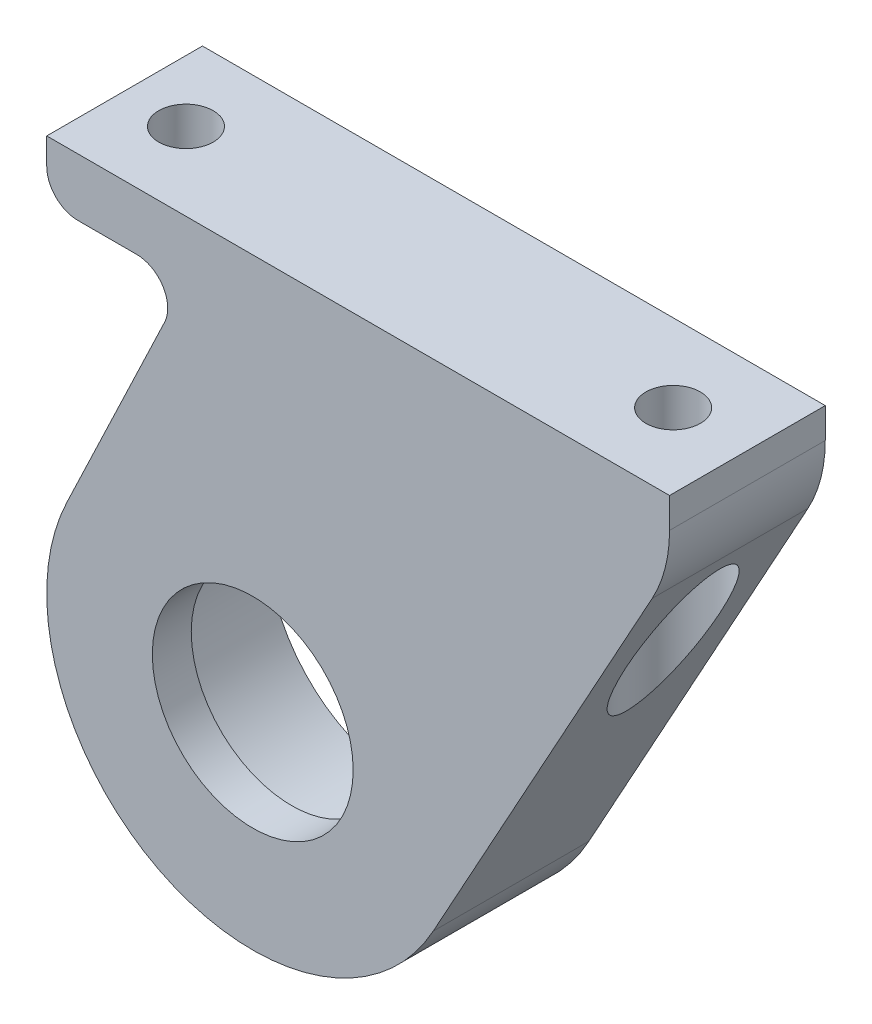
ISO-10303-21;
HEADER;
FILE_DESCRIPTION(('STEP AP214'),'2;1');
FILE_NAME('part.step','',(''),(''),'','','');
FILE_SCHEMA(('AUTOMOTIVE_DESIGN { 1 0 10303 214 1 1 1 1 }'));
ENDSEC;
DATA;
#1=APPLICATION_CONTEXT('core data for automotive mechanical design processes');
#2=APPLICATION_PROTOCOL_DEFINITION('international standard','automotive_design',2000,#1);
#3=PRODUCT_CONTEXT('',#1,'mechanical');
#4=PRODUCT('Part','Part','',(#3));
#5=PRODUCT_RELATED_PRODUCT_CATEGORY('part','',(#4));
#6=PRODUCT_DEFINITION_FORMATION('','',#4);
#7=PRODUCT_DEFINITION_CONTEXT('part definition',#1,'design');
#8=PRODUCT_DEFINITION('design','',#6,#7);
#9=PRODUCT_DEFINITION_SHAPE('','',#8);
#10=(LENGTH_UNIT() NAMED_UNIT(*) SI_UNIT(.MILLI.,.METRE.));
#11=(NAMED_UNIT(*) PLANE_ANGLE_UNIT() SI_UNIT($,.RADIAN.));
#12=(NAMED_UNIT(*) SI_UNIT($,.STERADIAN.) SOLID_ANGLE_UNIT());
#13=UNCERTAINTY_MEASURE_WITH_UNIT(LENGTH_MEASURE(1.E-05),#10,'distance_accuracy_value','');
#14=(GEOMETRIC_REPRESENTATION_CONTEXT(3) GLOBAL_UNCERTAINTY_ASSIGNED_CONTEXT((#13)) GLOBAL_UNIT_ASSIGNED_CONTEXT((#10,
#11,#12)) REPRESENTATION_CONTEXT('',''));
#15=CARTESIAN_POINT('',(0.,0.,0.));
#16=DIRECTION('',(0.,0.,1.));
#17=DIRECTION('',(1.,0.,0.));
#18=AXIS2_PLACEMENT_3D('',#15,#16,#17);
#19=CARTESIAN_POINT('',(-20.423245911174,18.3245528808047,30.));
#20=DIRECTION('',(0.,0.,-1.));
#21=DIRECTION('',(-1.,0.,0.));
#22=AXIS2_PLACEMENT_3D('',#19,#20,#21);
#23=CYLINDRICAL_SURFACE('',#22,2.);
#24=CARTESIAN_POINT('',(-20.4232459111739,16.3245528808047,27.2872392211941));
#25=CARTESIAN_POINT('',(-20.4887695492939,16.3245611442696,27.2316402768121));
#26=CARTESIAN_POINT('',(-20.551782925905,16.3277700807168,27.1733011664086));
#27=CARTESIAN_POINT('',(-20.6722658688388,16.3391942056474,27.0518072117411));
#28=CARTESIAN_POINT('',(-20.7297457982924,16.3473998163829,26.9886617824721));
#29=CARTESIAN_POINT('',(-20.8929254544888,16.3773502421294,26.7933198872976));
#30=CARTESIAN_POINT('',(-20.990019498793,16.404456252849,26.6546578776922));
#31=CARTESIAN_POINT('',(-21.1493133231444,16.4593263762254,26.3810891084359));
#32=CARTESIAN_POINT('',(-21.2142721504513,16.4866392343981,26.247654258765));
#33=CARTESIAN_POINT('',(-21.3240672508794,16.5378766477722,25.9718411288955));
#34=CARTESIAN_POINT('',(-21.3688910002988,16.5617990878733,25.8294573451789));
#35=CARTESIAN_POINT('',(-21.422374733152,16.5918592511803,25.601091292535));
#36=CARTESIAN_POINT('',(-21.4382973581837,16.601221299669,25.5171794330497));
#37=CARTESIAN_POINT('',(-21.4629547439993,16.6159811711615,25.3479328798189));
#38=CARTESIAN_POINT('',(-21.4716895825385,16.6213790370486,25.2625982014752));
#39=CARTESIAN_POINT('',(-21.4818035637808,16.6276465166273,25.0914473592264));
#40=CARTESIAN_POINT('',(-21.4831929708175,16.6285224491222,25.005632035034));
#41=CARTESIAN_POINT('',(-21.4786189332838,16.6256722751133,24.8342808120176));
#42=CARTESIAN_POINT('',(-21.4726561490108,16.6219465818797,24.7487448887923));
#43=CARTESIAN_POINT('',(-21.4548800024892,16.6111295588673,24.5911273517689));
#44=CARTESIAN_POINT('',(-21.4440407518192,16.6046048197193,24.5188938704581));
#45=CARTESIAN_POINT('',(-21.4171956758794,16.5889540710241,24.3756702318387));
#46=CARTESIAN_POINT('',(-21.4011880497648,16.5798271549163,24.3046805170052));
#47=CARTESIAN_POINT('',(-21.3455594083571,16.5494077073409,24.0939109952506));
#48=CARTESIAN_POINT('',(-21.2983529040815,16.525091153502,23.95650702534));
#49=CARTESIAN_POINT('',(-21.1796357220324,16.4718577610889,23.6780021937438));
#50=CARTESIAN_POINT('',(-21.1062763295459,16.4427234273619,23.5377413121952));
#51=CARTESIAN_POINT('',(-20.9379945901458,16.3899277771758,23.2700307414862));
#52=CARTESIAN_POINT('',(-20.8431428578687,16.3662490386409,23.1425410269608));
#53=CARTESIAN_POINT('',(-20.6899188983205,16.3418053319268,22.9676647911428));
#54=CARTESIAN_POINT('',(-20.6393779675668,16.3355665416617,22.9140865005566));
#55=CARTESIAN_POINT('',(-20.534258657173,16.3269396309748,22.8105747729889));
#56=CARTESIAN_POINT('',(-20.479674782226,16.3245568560844,22.7606464872836));
#57=CARTESIAN_POINT('',(-20.4232459111739,16.3245528808047,22.7127607788059));
#58=B_SPLINE_CURVE_WITH_KNOTS('',3,(#24,#25,#26,#27,#28,#29,#30,#31,#32,#33,#34,#35,#36,#37,#38,
#39,#40,#41,#42,#43,#44,#45,#46,#47,#48,#49,#50,#51,#52,#53,#54,#55,#56,#57),.UNSPECIFIED.,.F.,
.F.,(4,2,2,2,2,2,2,2,2,2,2,2,2,2,2,2,4),(0.,0.257437488815612,0.514383061708193,
1.02573296584412,1.47702144076985,1.92859022268281,2.18600973356862,2.44342645973293,
2.70048338254542,2.95751722085984,3.17726724204111,3.39709391467932,3.83727529526278,
4.31830047479043,4.79776755690636,5.01925937750808,5.24105798640269),.UNSPECIFIED.);
#59=CARTESIAN_POINT('',(-20.4232459111739,16.3245528808047,27.2872392211941));
#60=VERTEX_POINT('',#59);
#61=CARTESIAN_POINT('',(-20.4232459111739,16.3245528808047,22.7127607788059));
#62=VERTEX_POINT('',#61);
#63=EDGE_CURVE('E174',#60,#62,#58,.T.);
#64=ORIENTED_EDGE('',*,*,#63,.F.);
#65=DIRECTION('',(0.,0.,-1.));
#66=VECTOR('',#65,1.);
#67=CARTESIAN_POINT('',(-20.4232459111739,16.3245528808047,30.));
#68=LINE('',#67,#66);
#69=CARTESIAN_POINT('',(-20.4232459111739,16.3245528808047,30.));
#70=VERTEX_POINT('',#69);
#71=EDGE_CURVE('E144',#70,#60,#68,.T.);
#72=ORIENTED_EDGE('',*,*,#71,.F.);
#73=CARTESIAN_POINT('',(-20.423245911174,18.3245528808047,30.));
#74=DIRECTION('',(0.,0.,1.));
#75=DIRECTION('',(1.,0.,0.));
#76=AXIS2_PLACEMENT_3D('',#73,#74,#75);
#77=CIRCLE('',#76,2.);
#78=CARTESIAN_POINT('',(-22.423245911174,18.3245528808047,30.));
#79=VERTEX_POINT('',#78);
#80=EDGE_CURVE('E296',#79,#70,#77,.T.);
#81=ORIENTED_EDGE('',*,*,#80,.F.);
#82=DIRECTION('',(0.,0.,-1.));
#83=VECTOR('',#82,1.);
#84=CARTESIAN_POINT('',(-22.423245911174,18.3245528808047,30.));
#85=LINE('',#84,#83);
#86=CARTESIAN_POINT('',(-22.423245911174,18.3245528808047,20.));
#87=VERTEX_POINT('',#86);
#88=EDGE_CURVE('E303',#79,#87,#85,.T.);
#89=ORIENTED_EDGE('',*,*,#88,.T.);
#90=CARTESIAN_POINT('',(-20.423245911174,18.3245528808047,20.));
#91=DIRECTION('',(0.,0.,1.));
#92=DIRECTION('',(1.,0.,0.));
#93=AXIS2_PLACEMENT_3D('',#90,#91,#92);
#94=CIRCLE('',#93,2.);
#95=CARTESIAN_POINT('',(-20.4232459111739,16.3245528808047,20.));
#96=VERTEX_POINT('',#95);
#97=EDGE_CURVE('E292',#87,#96,#94,.T.);
#98=ORIENTED_EDGE('',*,*,#97,.T.);
#99=EDGE_CURVE('E179',#62,#96,#68,.T.);
#100=ORIENTED_EDGE('',*,*,#99,.F.);
#101=EDGE_LOOP('',(#64,#72,#81,#89,#98,#100));
#102=FACE_BOUND('',#101,.T.);
#103=ADVANCED_FACE('F41',(#102),#23,.T.);
#104=CARTESIAN_POINT('',(-20.4232459111739,16.3245528808047,30.));
#105=DIRECTION('',(0.,1.,0.));
#106=DIRECTION('',(0.,0.,1.));
#107=AXIS2_PLACEMENT_3D('',#104,#105,#106);
#108=PLANE('',#107);
#109=CARTESIAN_POINT('',(-18.481973971174,16.3245528808047,25.));
#110=DIRECTION('',(0.,1.,0.));
#111=DIRECTION('',(0.,0.,1.));
#112=AXIS2_PLACEMENT_3D('',#109,#110,#111);
#113=CIRCLE('',#112,3.);
#114=CARTESIAN_POINT('',(-16.6518746680662,16.3245528808047,22.6228722077338));
#115=VERTEX_POINT('',#114);
#116=EDGE_CURVE('E183',#62,#115,#113,.F.);
#117=ORIENTED_EDGE('',*,*,#116,.F.);
#118=ORIENTED_EDGE('',*,*,#99,.T.);
#119=DIRECTION('',(1.,0.,0.));
#120=VECTOR('',#119,1.);
#121=CARTESIAN_POINT('',(-20.4232459111739,16.3245528808047,20.));
#122=LINE('',#121,#120);
#123=CARTESIAN_POINT('',(-16.6518746680662,16.3245528808047,20.));
#124=VERTEX_POINT('',#123);
#125=EDGE_CURVE('E235',#96,#124,#122,.T.);
#126=ORIENTED_EDGE('',*,*,#125,.T.);
#127=DIRECTION('',(0.,0.,-1.));
#128=VECTOR('',#127,1.);
#129=CARTESIAN_POINT('',(-16.6518746680662,16.3245528808047,30.));
#130=LINE('',#129,#128);
#131=EDGE_CURVE('E232',#115,#124,#130,.T.);
#132=ORIENTED_EDGE('',*,*,#131,.F.);
#133=EDGE_LOOP('',(#117,#118,#126,#132));
#134=FACE_BOUND('',#133,.T.);
#135=ADVANCED_FACE('F159',(#134),#108,.F.);
#136=CARTESIAN_POINT('',(-16.6518746680662,14.3245528808047,30.));
#137=DIRECTION('',(0.,0.,-1.));
#138=DIRECTION('',(-1.,0.,0.));
#139=AXIS2_PLACEMENT_3D('',#136,#137,#138);
#140=CYLINDRICAL_SURFACE('',#139,2.);
#141=CARTESIAN_POINT('',(-16.6518746680662,16.3245528808047,22.6228722077338));
#142=CARTESIAN_POINT('',(-16.5835636770514,16.324549643518,22.6754362551879));
#143=CARTESIAN_POINT('',(-16.5176343482555,16.3210561128765,22.7309071471586));
#144=CARTESIAN_POINT('',(-16.3911842158571,16.3085056162088,22.8468845897449));
#145=CARTESIAN_POINT('',(-16.3306517364897,16.2994610114274,22.9073796942529));
#146=CARTESIAN_POINT('',(-16.2157149457288,16.2772867450315,23.0324508585251));
#147=CARTESIAN_POINT('',(-16.1612726893345,16.2641845460208,23.0969972243211));
#148=CARTESIAN_POINT('',(-16.0582682598351,16.2351799310674,23.2300472511259));
#149=CARTESIAN_POINT('',(-16.0097088683158,16.2192761991344,23.2985527616945));
#150=CARTESIAN_POINT('',(-15.8862101458836,16.1740522757982,23.4891840476809));
#151=CARTESIAN_POINT('',(-15.8170870644824,16.1432379557405,23.6147776094574));
#152=CARTESIAN_POINT('',(-15.6972166485052,16.0832808890627,23.8749678468779));
#153=CARTESIAN_POINT('',(-15.6464918832367,16.054140232149,24.0095753419029));
#154=CARTESIAN_POINT('',(-15.565086491734,16.0041912388377,24.284479186991));
#155=CARTESIAN_POINT('',(-15.5341553189924,15.9832800955908,24.4246795461986));
#156=CARTESIAN_POINT('',(-15.5030296953724,15.9617141302766,24.6379720147396));
#157=CARTESIAN_POINT('',(-15.495199805572,15.9561593368413,24.7095239314719));
#158=CARTESIAN_POINT('',(-15.4847028585106,15.9486700999029,24.8532094356609));
#159=CARTESIAN_POINT('',(-15.482035611577,15.9467355233952,24.9253430016504));
#160=CARTESIAN_POINT('',(-15.4819143369453,15.9466480971483,25.0697487242641));
#161=CARTESIAN_POINT('',(-15.4844698336752,15.9485021565335,25.1420208935324));
#162=CARTESIAN_POINT('',(-15.4947639116706,15.9558497205583,25.2859931025052));
#163=CARTESIAN_POINT('',(-15.5025026983006,15.9613433694003,25.3576931194269));
#164=CARTESIAN_POINT('',(-15.5333864985258,15.9827590887057,25.5714349850466));
#165=CARTESIAN_POINT('',(-15.5641987401963,16.0036145781758,25.7119453013466));
#166=CARTESIAN_POINT('',(-15.6449776615086,16.053241774724,25.9858782513185));
#167=CARTESIAN_POINT('',(-15.6949740175126,16.0820257269677,26.1192895374218));
#168=CARTESIAN_POINT('',(-15.8130488492405,16.1413444976932,26.3772844481672));
#169=CARTESIAN_POINT('',(-15.8811055211114,16.1718771703556,26.5018784894611));
#170=CARTESIAN_POINT('',(-16.003617730507,16.2172088973466,26.692609647995));
#171=CARTESIAN_POINT('',(-16.0524884622794,16.233387010334,26.7620564339689));
#172=CARTESIAN_POINT('',(-16.1562584780787,16.2629215995418,26.8969138355029));
#173=CARTESIAN_POINT('',(-16.2111549375369,16.2762793892806,26.9623263198785));
#174=CARTESIAN_POINT('',(-16.3271519187017,16.2989055796637,27.0890562979459));
#175=CARTESIAN_POINT('',(-16.3882922118222,16.308145459133,27.1503428093555));
#176=CARTESIAN_POINT('',(-16.5160917523951,16.3209737854072,27.2677948656898));
#177=CARTESIAN_POINT('',(-16.582763201648,16.3245493679871,27.3239484817292));
#178=CARTESIAN_POINT('',(-16.6518746680662,16.3245528808047,27.3771277922662));
#179=B_SPLINE_CURVE_WITH_KNOTS('',3,(#141,#142,#143,#144,#145,#146,#147,#148,#149,#150,#151,
#152,#153,#154,#155,#156,#157,#158,#159,#160,#161,#162,#163,#164,#165,#166,#167,#168,#169,#170,
#171,#172,#173,#174,#175,#176,#177,#178),.UNSPECIFIED.,.F.,.F.,(4,2,2,2,2,2,2,2,2,2,2,2,2,2,2,2,
2,2,4),(0.,0.258265733289105,0.515958431416804,0.771943784965977,1.02804970714106,
1.46639445313713,1.90527511463488,2.33848441808795,2.55482724017938,2.77116211380854,
2.98789185737173,3.20463018838471,3.63861991957701,4.07328372410993,4.50742513653102,
4.76647032614446,5.02539460235371,5.28608536273293,5.54736733528842),.UNSPECIFIED.);
#180=CARTESIAN_POINT('',(-16.6518746680662,16.3245528808047,27.3771277922662));
#181=VERTEX_POINT('',#180);
#182=EDGE_CURVE('E58',#115,#181,#179,.T.);
#183=ORIENTED_EDGE('',*,*,#182,.F.);
#184=ORIENTED_EDGE('',*,*,#131,.T.);
#185=CARTESIAN_POINT('',(-16.6518746680662,14.3245528808047,20.));
#186=DIRECTION('',(0.,0.,-1.));
#187=DIRECTION('',(-1.,0.,0.));
#188=AXIS2_PLACEMENT_3D('',#185,#186,#187);
#189=CIRCLE('',#188,2.);
#190=CARTESIAN_POINT('',(-14.846773288379,13.4633856444032,20.));
#191=VERTEX_POINT('',#190);
#192=EDGE_CURVE('E322',#124,#191,#189,.T.);
#193=ORIENTED_EDGE('',*,*,#192,.T.);
#194=DIRECTION('',(0.,0.,-1.));
#195=VECTOR('',#194,1.);
#196=CARTESIAN_POINT('',(-14.846773288379,13.4633856444032,30.));
#197=LINE('',#196,#195);
#198=CARTESIAN_POINT('',(-14.846773288379,13.4633856444032,30.));
#199=VERTEX_POINT('',#198);
#200=EDGE_CURVE('E237',#199,#191,#197,.T.);
#201=ORIENTED_EDGE('',*,*,#200,.F.);
#202=CARTESIAN_POINT('',(-16.6518746680662,14.3245528808047,30.));
#203=DIRECTION('',(0.,0.,-1.));
#204=DIRECTION('',(-1.,0.,0.));
#205=AXIS2_PLACEMENT_3D('',#202,#203,#204);
#206=CIRCLE('',#205,2.);
#207=CARTESIAN_POINT('',(-16.6518746680662,16.3245528808047,30.));
#208=VERTEX_POINT('',#207);
#209=EDGE_CURVE('E231',#208,#199,#206,.T.);
#210=ORIENTED_EDGE('',*,*,#209,.F.);
#211=EDGE_CURVE('E227',#208,#181,#130,.T.);
#212=ORIENTED_EDGE('',*,*,#211,.T.);
#213=EDGE_LOOP('',(#183,#184,#193,#201,#210,#212));
#214=FACE_BOUND('',#213,.T.);
#215=ADVANCED_FACE('F149',(#214),#140,.F.);
#216=CARTESIAN_POINT('',(-21.1339262047569,0.284820641068237,30.));
#217=DIRECTION('',(0.902550689843615,-0.430583618200709,0.));
#218=DIRECTION('',(0.430583618200709,0.902550689843615,0.));
#219=AXIS2_PLACEMENT_3D('',#216,#217,#218);
#220=PLANE('',#219);
#221=DIRECTION('',(-0.430583618200709,-0.902550689843615,0.));
#222=VECTOR('',#221,1.);
#223=CARTESIAN_POINT('',(-21.1339262047569,0.284820641068237,20.));
#224=LINE('',#223,#222);
#225=CARTESIAN_POINT('',(-21.1339262047569,0.284820641068232,20.));
#226=VERTEX_POINT('',#225);
#227=EDGE_CURVE('E321',#191,#226,#224,.T.);
#228=ORIENTED_EDGE('',*,*,#227,.T.);
#229=DIRECTION('',(0.,0.,-1.));
#230=VECTOR('',#229,1.);
#231=CARTESIAN_POINT('',(-21.1339262047569,0.284820641068232,30.));
#232=LINE('',#231,#230);
#233=CARTESIAN_POINT('',(-21.1339262047569,0.284820641068232,30.));
#234=VERTEX_POINT('',#233);
#235=EDGE_CURVE('E239',#234,#226,#232,.T.);
#236=ORIENTED_EDGE('',*,*,#235,.F.);
#237=DIRECTION('',(-0.430583618200709,-0.902550689843615,0.));
#238=VECTOR('',#237,1.);
#239=CARTESIAN_POINT('',(-21.1339262047569,0.284820641068237,30.));
#240=LINE('',#239,#238);
#241=EDGE_CURVE('E348',#199,#234,#240,.T.);
#242=ORIENTED_EDGE('',*,*,#241,.F.);
#243=ORIENTED_EDGE('',*,*,#200,.T.);
#244=EDGE_LOOP('',(#228,#236,#242,#243));
#245=FACE_BOUND('',#244,.T.);
#246=CARTESIAN_POINT('',(-18.481973971174,5.84360461862522,25.));
#247=DIRECTION('',(0.902550689843615,-0.430583618200709,0.));
#248=DIRECTION('',(0.43058361820071,0.902550689843615,0.));
#249=AXIS2_PLACEMENT_3D('',#246,#247,#248);
#250=ELLIPSE('',#249,6.96728782329475,3.);
#251=CARTESIAN_POINT('',(-18.7296001464338,5.32455288080469,27.9897627459928));
#252=VERTEX_POINT('',#251);
#253=CARTESIAN_POINT('',(-18.7296001464338,5.32455288080469,22.0102372540072));
#254=VERTEX_POINT('',#253);
#255=EDGE_CURVE('E11',#252,#254,#250,.F.);
#256=ORIENTED_EDGE('',*,*,#255,.F.);
#257=DIRECTION('',(0.,0.,-1.));
#258=VECTOR('',#257,1.);
#259=CARTESIAN_POINT('',(-18.7296001464338,5.32455288080469,30.));
#260=LINE('',#259,#258);
#261=EDGE_CURVE('E50',#252,#254,#260,.T.);
#262=ORIENTED_EDGE('',*,*,#261,.T.);
#263=EDGE_LOOP('',(#256,#262));
#264=FACE_BOUND('',#263,.T.);
#265=ADVANCED_FACE('F146',(#245,#264),#220,.F.);
#266=CARTESIAN_POINT('',(-9.19257548007548,-5.41208930437528,30.));
#267=DIRECTION('',(0.,0.,-1.));
#268=DIRECTION('',(-1.,0.,0.));
#269=AXIS2_PLACEMENT_3D('',#266,#267,#268);
#270=CYLINDRICAL_SURFACE('',#269,9.05);
#271=CARTESIAN_POINT('',(-9.19257548007548,-5.41208930437528,20.));
#272=DIRECTION('',(0.,0.,1.));
#273=DIRECTION('',(1.,0.,0.));
#274=AXIS2_PLACEMENT_3D('',#271,#272,#273);
#275=CIRCLE('',#274,9.05);
#276=CARTESIAN_POINT('',(-0.142575480075477,-5.41208930437528,20.));
#277=VERTEX_POINT('',#276);
#278=EDGE_CURVE('E246',#277,#277,#275,.T.);
#279=ORIENTED_EDGE('',*,*,#278,.F.);
#280=EDGE_LOOP('',(#279));
#281=FACE_BOUND('',#280,.T.);
#282=CARTESIAN_POINT('',(-9.19257548007548,-5.41208930437528,27.5));
#283=DIRECTION('',(0.,0.,1.));
#284=DIRECTION('',(1.,0.,0.));
#285=AXIS2_PLACEMENT_3D('',#282,#283,#284);
#286=CIRCLE('',#285,9.05);
#287=CARTESIAN_POINT('',(-0.142575480075477,-5.41208930437528,27.5));
#288=VERTEX_POINT('',#287);
#289=EDGE_CURVE('E244',#288,#288,#286,.T.);
#290=ORIENTED_EDGE('',*,*,#289,.T.);
#291=EDGE_LOOP('',(#290));
#292=FACE_BOUND('',#291,.T.);
#293=ADVANCED_FACE('F148',(#281,#292),#270,.F.);
#294=CARTESIAN_POINT('',(-20.423245911174,18.3245528808047,30.));
#295=DIRECTION('',(0.,0.,1.));
#296=DIRECTION('',(1.,0.,0.));
#297=AXIS2_PLACEMENT_3D('',#294,#295,#296);
#298=PLANE('',#297);
#299=ORIENTED_EDGE('',*,*,#80,.T.);
#300=DIRECTION('',(1.,0.,0.));
#301=VECTOR('',#300,1.);
#302=CARTESIAN_POINT('',(-20.4232459111739,16.3245528808047,30.));
#303=LINE('',#302,#301);
#304=EDGE_CURVE('E299',#70,#208,#303,.T.);
#305=ORIENTED_EDGE('',*,*,#304,.T.);
#306=ORIENTED_EDGE('',*,*,#209,.T.);
#307=ORIENTED_EDGE('',*,*,#241,.T.);
#308=CARTESIAN_POINT('',(-9.19257548007548,-5.41208930437528,30.));
#309=DIRECTION('',(0.,0.,1.));
#310=DIRECTION('',(1.,0.,0.));
#311=AXIS2_PLACEMENT_3D('',#308,#309,#310);
#312=CIRCLE('',#311,13.2306704310985);
#313=CARTESIAN_POINT('',(2.39705576219197,-11.7941804761309,30.));
#314=VERTEX_POINT('',#313);
#315=EDGE_CURVE('E319',#234,#314,#312,.T.);
#316=ORIENTED_EDGE('',*,*,#315,.T.);
#317=DIRECTION('',(0.482370958069871,0.875967042080211,0.));
#318=VECTOR('',#317,1.);
#319=CARTESIAN_POINT('',(2.39705576219197,-11.7941804761309,30.));
#320=LINE('',#319,#318);
#321=CARTESIAN_POINT('',(16.4604574675479,13.7444142243445,30.));
#322=VERTEX_POINT('',#321);
#323=EDGE_CURVE('E344',#314,#322,#320,.T.);
#324=ORIENTED_EDGE('',*,*,#323,.T.);
#325=CARTESIAN_POINT('',(8.57675408882604,18.0857528469733,30.));
#326=DIRECTION('',(0.,0.,1.));
#327=DIRECTION('',(1.,0.,0.));
#328=AXIS2_PLACEMENT_3D('',#325,#326,#327);
#329=CIRCLE('',#328,9.);
#330=CARTESIAN_POINT('',(17.576754088826,18.0857528469733,30.));
#331=VERTEX_POINT('',#330);
#332=EDGE_CURVE('E340',#322,#331,#329,.T.);
#333=ORIENTED_EDGE('',*,*,#332,.T.);
#334=DIRECTION('',(0.,1.,0.));
#335=VECTOR('',#334,1.);
#336=CARTESIAN_POINT('',(17.576754088826,18.0857528469733,30.));
#337=LINE('',#336,#335);
#338=CARTESIAN_POINT('',(17.576754088826,20.0279106956247,30.));
#339=VERTEX_POINT('',#338);
#340=EDGE_CURVE('E354',#331,#339,#337,.T.);
#341=ORIENTED_EDGE('',*,*,#340,.T.);
#342=DIRECTION('',(-1.,0.,0.));
#343=VECTOR('',#342,1.);
#344=CARTESIAN_POINT('',(17.576754088826,20.0279106956247,30.));
#345=LINE('',#344,#343);
#346=CARTESIAN_POINT('',(-22.423245911174,20.0279106956247,30.));
#347=VERTEX_POINT('',#346);
#348=EDGE_CURVE('E357',#339,#347,#345,.T.);
#349=ORIENTED_EDGE('',*,*,#348,.T.);
#350=DIRECTION('',(0.,-1.,0.));
#351=VECTOR('',#350,1.);
#352=CARTESIAN_POINT('',(-22.423245911174,18.3245528808047,30.));
#353=LINE('',#352,#351);
#354=EDGE_CURVE('E305',#347,#79,#353,.T.);
#355=ORIENTED_EDGE('',*,*,#354,.T.);
#356=EDGE_LOOP('',(#299,#305,#306,#307,#316,#324,#333,#341,#349,#355));
#357=FACE_BOUND('',#356,.T.);
#358=CARTESIAN_POINT('',(-9.19257548007548,-5.41208930437528,30.));
#359=DIRECTION('',(0.,0.,1.));
#360=DIRECTION('',(1.,0.,0.));
#361=AXIS2_PLACEMENT_3D('',#358,#359,#360);
#362=CIRCLE('',#361,6.45);
#363=CARTESIAN_POINT('',(-2.74257548007547,-5.41208930437528,30.));
#364=VERTEX_POINT('',#363);
#365=EDGE_CURVE('E182',#364,#364,#362,.T.);
#366=ORIENTED_EDGE('',*,*,#365,.F.);
#367=EDGE_LOOP('',(#366));
#368=FACE_BOUND('',#367,.T.);
#369=ADVANCED_FACE('F156',(#357,#368),#298,.T.);
#370=CARTESIAN_POINT('',(-20.423245911174,18.3245528808047,20.));
#371=DIRECTION('',(0.,0.,1.));
#372=DIRECTION('',(1.,0.,0.));
#373=AXIS2_PLACEMENT_3D('',#370,#371,#372);
#374=PLANE('',#373);
#375=ORIENTED_EDGE('',*,*,#97,.F.);
#376=DIRECTION('',(0.,-1.,0.));
#377=VECTOR('',#376,1.);
#378=CARTESIAN_POINT('',(-22.423245911174,18.3245528808047,20.));
#379=LINE('',#378,#377);
#380=CARTESIAN_POINT('',(-22.423245911174,20.0279106956247,20.));
#381=VERTEX_POINT('',#380);
#382=EDGE_CURVE('E287',#381,#87,#379,.T.);
#383=ORIENTED_EDGE('',*,*,#382,.F.);
#384=DIRECTION('',(-1.,0.,0.));
#385=VECTOR('',#384,1.);
#386=CARTESIAN_POINT('',(17.576754088826,20.0279106956247,20.));
#387=LINE('',#386,#385);
#388=CARTESIAN_POINT('',(17.576754088826,20.0279106956247,20.));
#389=VERTEX_POINT('',#388);
#390=EDGE_CURVE('E279',#389,#381,#387,.T.);
#391=ORIENTED_EDGE('',*,*,#390,.F.);
#392=DIRECTION('',(0.,1.,0.));
#393=VECTOR('',#392,1.);
#394=CARTESIAN_POINT('',(17.576754088826,18.0857528469733,20.));
#395=LINE('',#394,#393);
#396=CARTESIAN_POINT('',(17.576754088826,18.0857528469733,20.));
#397=VERTEX_POINT('',#396);
#398=EDGE_CURVE('E288',#397,#389,#395,.T.);
#399=ORIENTED_EDGE('',*,*,#398,.F.);
#400=CARTESIAN_POINT('',(8.57675408882604,18.0857528469733,20.));
#401=DIRECTION('',(0.,0.,1.));
#402=DIRECTION('',(1.,0.,0.));
#403=AXIS2_PLACEMENT_3D('',#400,#401,#402);
#404=CIRCLE('',#403,9.);
#405=CARTESIAN_POINT('',(16.4604574675479,13.7444142243445,20.));
#406=VERTEX_POINT('',#405);
#407=EDGE_CURVE('E331',#406,#397,#404,.T.);
#408=ORIENTED_EDGE('',*,*,#407,.F.);
#409=DIRECTION('',(0.482370958069871,0.875967042080211,0.));
#410=VECTOR('',#409,1.);
#411=CARTESIAN_POINT('',(2.39705576219197,-11.7941804761309,20.));
#412=LINE('',#411,#410);
#413=CARTESIAN_POINT('',(2.39705576219197,-11.7941804761309,20.));
#414=VERTEX_POINT('',#413);
#415=EDGE_CURVE('E324',#414,#406,#412,.T.);
#416=ORIENTED_EDGE('',*,*,#415,.F.);
#417=CARTESIAN_POINT('',(-9.19257548007548,-5.41208930437528,20.));
#418=DIRECTION('',(0.,0.,1.));
#419=DIRECTION('',(1.,0.,0.));
#420=AXIS2_PLACEMENT_3D('',#417,#418,#419);
#421=CIRCLE('',#420,13.2306704310985);
#422=EDGE_CURVE('E316',#226,#414,#421,.T.);
#423=ORIENTED_EDGE('',*,*,#422,.F.);
#424=ORIENTED_EDGE('',*,*,#227,.F.);
#425=ORIENTED_EDGE('',*,*,#192,.F.);
#426=ORIENTED_EDGE('',*,*,#125,.F.);
#427=EDGE_LOOP('',(#375,#383,#391,#399,#408,#416,#423,#424,#425,#426));
#428=FACE_BOUND('',#427,.T.);
#429=ORIENTED_EDGE('',*,*,#278,.T.);
#430=EDGE_LOOP('',(#429));
#431=FACE_BOUND('',#430,.T.);
#432=ADVANCED_FACE('F216',(#428,#431),#374,.F.);
#433=EDGE_CURVE('E188',#181,#60,#113,.F.);
#434=ORIENTED_EDGE('',*,*,#433,.F.);
#435=ORIENTED_EDGE('',*,*,#211,.F.);
#436=ORIENTED_EDGE('',*,*,#304,.F.);
#437=ORIENTED_EDGE('',*,*,#71,.T.);
#438=EDGE_LOOP('',(#434,#435,#436,#437));
#439=FACE_BOUND('',#438,.T.);
#440=ADVANCED_FACE('F169',(#439),#108,.F.);
#441=CARTESIAN_POINT('',(-9.19257548007548,-5.41208930437528,30.));
#442=DIRECTION('',(0.,0.,-1.));
#443=DIRECTION('',(-1.,0.,0.));
#444=AXIS2_PLACEMENT_3D('',#441,#442,#443);
#445=CYLINDRICAL_SURFACE('',#444,13.2306704310985);
#446=ORIENTED_EDGE('',*,*,#422,.T.);
#447=DIRECTION('',(0.,0.,-1.));
#448=VECTOR('',#447,1.);
#449=CARTESIAN_POINT('',(2.39705576219197,-11.7941804761309,30.));
#450=LINE('',#449,#448);
#451=EDGE_CURVE('E312',#314,#414,#450,.T.);
#452=ORIENTED_EDGE('',*,*,#451,.F.);
#453=ORIENTED_EDGE('',*,*,#315,.F.);
#454=ORIENTED_EDGE('',*,*,#235,.T.);
#455=EDGE_LOOP('',(#446,#452,#453,#454));
#456=FACE_BOUND('',#455,.T.);
#457=ADVANCED_FACE('F215',(#456),#445,.T.);
#458=CARTESIAN_POINT('',(2.39705576219197,-11.7941804761309,30.));
#459=DIRECTION('',(-0.875967042080211,0.482370958069871,0.));
#460=DIRECTION('',(-0.482370958069872,-0.875967042080211,0.));
#461=AXIS2_PLACEMENT_3D('',#458,#459,#460);
#462=PLANE('',#461);
#463=CARTESIAN_POINT('',(12.806754088826,7.10942990832374,25.));
#464=DIRECTION('',(-0.875967042080211,0.482370958069871,0.));
#465=DIRECTION('',(0.482370958069872,0.875967042080211,0.));
#466=AXIS2_PLACEMENT_3D('',#463,#464,#465);
#467=ELLIPSE('',#466,6.21927989198192,3.);
#468=CARTESIAN_POINT('',(15.8067540888261,12.5573141191721,25.));
#469=VERTEX_POINT('',#468);
#470=EDGE_CURVE('E45',#469,#469,#467,.T.);
#471=ORIENTED_EDGE('',*,*,#470,.T.);
#472=EDGE_LOOP('',(#471));
#473=FACE_BOUND('',#472,.T.);
#474=ORIENTED_EDGE('',*,*,#415,.T.);
#475=DIRECTION('',(0.,0.,-1.));
#476=VECTOR('',#475,1.);
#477=CARTESIAN_POINT('',(16.4604574675479,13.7444142243445,30.));
#478=LINE('',#477,#476);
#479=EDGE_CURVE('E310',#322,#406,#478,.T.);
#480=ORIENTED_EDGE('',*,*,#479,.F.);
#481=ORIENTED_EDGE('',*,*,#323,.F.);
#482=ORIENTED_EDGE('',*,*,#451,.T.);
#483=EDGE_LOOP('',(#474,#480,#481,#482));
#484=FACE_BOUND('',#483,.T.);
#485=ADVANCED_FACE('F222',(#473,#484),#462,.F.);
#486=CARTESIAN_POINT('',(8.57675408882604,18.0857528469733,30.));
#487=DIRECTION('',(0.,0.,-1.));
#488=DIRECTION('',(-1.,0.,0.));
#489=AXIS2_PLACEMENT_3D('',#486,#487,#488);
#490=CYLINDRICAL_SURFACE('',#489,9.);
#491=ORIENTED_EDGE('',*,*,#407,.T.);
#492=DIRECTION('',(0.,0.,-1.));
#493=VECTOR('',#492,1.);
#494=CARTESIAN_POINT('',(17.576754088826,18.0857528469733,30.));
#495=LINE('',#494,#493);
#496=EDGE_CURVE('E308',#331,#397,#495,.T.);
#497=ORIENTED_EDGE('',*,*,#496,.F.);
#498=ORIENTED_EDGE('',*,*,#332,.F.);
#499=ORIENTED_EDGE('',*,*,#479,.T.);
#500=EDGE_LOOP('',(#491,#497,#498,#499));
#501=FACE_BOUND('',#500,.T.);
#502=ADVANCED_FACE('F337',(#501),#490,.T.);
#503=CARTESIAN_POINT('',(17.576754088826,18.0857528469733,30.));
#504=DIRECTION('',(-1.,0.,0.));
#505=DIRECTION('',(0.,0.,1.));
#506=AXIS2_PLACEMENT_3D('',#503,#504,#505);
#507=PLANE('',#506);
#508=ORIENTED_EDGE('',*,*,#398,.T.);
#509=DIRECTION('',(0.,0.,-1.));
#510=VECTOR('',#509,1.);
#511=CARTESIAN_POINT('',(17.576754088826,20.0279106956247,30.));
#512=LINE('',#511,#510);
#513=EDGE_CURVE('E284',#339,#389,#512,.T.);
#514=ORIENTED_EDGE('',*,*,#513,.F.);
#515=ORIENTED_EDGE('',*,*,#340,.F.);
#516=ORIENTED_EDGE('',*,*,#496,.T.);
#517=EDGE_LOOP('',(#508,#514,#515,#516));
#518=FACE_BOUND('',#517,.T.);
#519=ADVANCED_FACE('F274',(#518),#507,.F.);
#520=CARTESIAN_POINT('',(17.576754088826,20.0279106956247,30.));
#521=DIRECTION('',(0.,-1.,0.));
#522=DIRECTION('',(0.,0.,-1.));
#523=AXIS2_PLACEMENT_3D('',#520,#521,#522);
#524=PLANE('',#523);
#525=CARTESIAN_POINT('',(-18.481973971174,20.0279106956247,25.));
#526=DIRECTION('',(0.,1.,0.));
#527=DIRECTION('',(0.,0.,1.));
#528=AXIS2_PLACEMENT_3D('',#525,#526,#527);
#529=CIRCLE('',#528,1.75);
#530=CARTESIAN_POINT('',(-18.481973971174,20.0279106956247,26.75));
#531=VERTEX_POINT('',#530);
#532=EDGE_CURVE('E250',#531,#531,#529,.T.);
#533=ORIENTED_EDGE('',*,*,#532,.F.);
#534=EDGE_LOOP('',(#533));
#535=FACE_BOUND('',#534,.T.);
#536=CARTESIAN_POINT('',(12.806754088826,20.0279106956247,25.));
#537=DIRECTION('',(0.,1.,0.));
#538=DIRECTION('',(0.,0.,1.));
#539=AXIS2_PLACEMENT_3D('',#536,#537,#538);
#540=CIRCLE('',#539,1.75);
#541=CARTESIAN_POINT('',(12.806754088826,20.0279106956247,26.75));
#542=VERTEX_POINT('',#541);
#543=EDGE_CURVE('E257',#542,#542,#540,.T.);
#544=ORIENTED_EDGE('',*,*,#543,.F.);
#545=EDGE_LOOP('',(#544));
#546=FACE_BOUND('',#545,.T.);
#547=ORIENTED_EDGE('',*,*,#390,.T.);
#548=DIRECTION('',(0.,0.,-1.));
#549=VECTOR('',#548,1.);
#550=CARTESIAN_POINT('',(-22.423245911174,20.0279106956247,30.));
#551=LINE('',#550,#549);
#552=EDGE_CURVE('E282',#347,#381,#551,.T.);
#553=ORIENTED_EDGE('',*,*,#552,.F.);
#554=ORIENTED_EDGE('',*,*,#348,.F.);
#555=ORIENTED_EDGE('',*,*,#513,.T.);
#556=EDGE_LOOP('',(#547,#553,#554,#555));
#557=FACE_BOUND('',#556,.T.);
#558=ADVANCED_FACE('F270',(#535,#546,#557),#524,.F.);
#559=CARTESIAN_POINT('',(-22.423245911174,18.3245528808047,30.));
#560=DIRECTION('',(1.,0.,0.));
#561=DIRECTION('',(0.,1.,0.));
#562=AXIS2_PLACEMENT_3D('',#559,#560,#561);
#563=PLANE('',#562);
#564=ORIENTED_EDGE('',*,*,#382,.T.);
#565=ORIENTED_EDGE('',*,*,#88,.F.);
#566=ORIENTED_EDGE('',*,*,#354,.F.);
#567=ORIENTED_EDGE('',*,*,#552,.T.);
#568=EDGE_LOOP('',(#564,#565,#566,#567));
#569=FACE_BOUND('',#568,.T.);
#570=ADVANCED_FACE('F273',(#569),#563,.F.);
#571=CARTESIAN_POINT('',(-9.19257548007548,-5.41208930437528,27.5));
#572=DIRECTION('',(0.,0.,1.));
#573=DIRECTION('',(1.,0.,0.));
#574=AXIS2_PLACEMENT_3D('',#571,#572,#573);
#575=PLANE('',#574);
#576=CARTESIAN_POINT('',(-9.19257548007548,-5.41208930437528,27.5));
#577=DIRECTION('',(0.,0.,1.));
#578=DIRECTION('',(1.,0.,0.));
#579=AXIS2_PLACEMENT_3D('',#576,#577,#578);
#580=CIRCLE('',#579,6.45);
#581=CARTESIAN_POINT('',(-2.74257548007547,-5.41208930437528,27.5));
#582=VERTEX_POINT('',#581);
#583=EDGE_CURVE('E186',#582,#582,#580,.T.);
#584=ORIENTED_EDGE('',*,*,#583,.T.);
#585=EDGE_LOOP('',(#584));
#586=FACE_BOUND('',#585,.T.);
#587=ORIENTED_EDGE('',*,*,#289,.F.);
#588=EDGE_LOOP('',(#587));
#589=FACE_BOUND('',#588,.T.);
#590=ADVANCED_FACE('F366',(#586,#589),#575,.F.);
#591=CARTESIAN_POINT('',(-9.19257548007548,-5.41208930437528,27.5));
#592=DIRECTION('',(0.,0.,1.));
#593=DIRECTION('',(1.,0.,0.));
#594=AXIS2_PLACEMENT_3D('',#591,#592,#593);
#595=CYLINDRICAL_SURFACE('',#594,6.45);
#596=ORIENTED_EDGE('',*,*,#583,.F.);
#597=EDGE_LOOP('',(#596));
#598=FACE_BOUND('',#597,.T.);
#599=ORIENTED_EDGE('',*,*,#365,.T.);
#600=EDGE_LOOP('',(#599));
#601=FACE_BOUND('',#600,.T.);
#602=ADVANCED_FACE('F205',(#598,#601),#595,.F.);
#603=CARTESIAN_POINT('',(-18.481973971174,5.32455288080469,25.));
#604=DIRECTION('',(0.,-1.,0.));
#605=DIRECTION('',(0.,0.,-1.));
#606=AXIS2_PLACEMENT_3D('',#603,#604,#605);
#607=PLANE('',#606);
#608=CARTESIAN_POINT('',(-18.481973971174,5.32455288080469,25.));
#609=DIRECTION('',(0.,-1.,0.));
#610=DIRECTION('',(0.,0.,-1.));
#611=AXIS2_PLACEMENT_3D('',#608,#609,#610);
#612=CIRCLE('',#611,3.);
#613=EDGE_CURVE('E65',#254,#252,#612,.T.);
#614=ORIENTED_EDGE('',*,*,#613,.F.);
#615=ORIENTED_EDGE('',*,*,#261,.F.);
#616=EDGE_LOOP('',(#614,#615));
#617=FACE_BOUND('',#616,.T.);
#618=ADVANCED_FACE('F142',(#617),#607,.F.);
#619=CARTESIAN_POINT('',(-18.481973971174,5.32455288080469,25.));
#620=DIRECTION('',(0.,1.,0.));
#621=DIRECTION('',(0.,0.,1.));
#622=AXIS2_PLACEMENT_3D('',#619,#620,#621);
#623=CYLINDRICAL_SURFACE('',#622,3.);
#624=ORIENTED_EDGE('',*,*,#255,.T.);
#625=ORIENTED_EDGE('',*,*,#613,.T.);
#626=EDGE_LOOP('',(#624,#625));
#627=FACE_BOUND('',#626,.T.);
#628=ADVANCED_FACE('F138',(#627),#623,.F.);
#629=CARTESIAN_POINT('',(-18.481973971174,17.0245528808047,25.));
#630=DIRECTION('',(0.,-1.,0.));
#631=DIRECTION('',(0.,0.,-1.));
#632=AXIS2_PLACEMENT_3D('',#629,#630,#631);
#633=CIRCLE('',#632,3.);
#634=CARTESIAN_POINT('',(-18.481973971174,17.0245528808047,22.));
#635=VERTEX_POINT('',#634);
#636=EDGE_CURVE('E140',#635,#635,#633,.T.);
#637=ORIENTED_EDGE('',*,*,#636,.F.);
#638=EDGE_LOOP('',(#637));
#639=FACE_BOUND('',#638,.T.);
#640=ORIENTED_EDGE('',*,*,#63,.T.);
#641=ORIENTED_EDGE('',*,*,#116,.T.);
#642=ORIENTED_EDGE('',*,*,#182,.T.);
#643=ORIENTED_EDGE('',*,*,#433,.T.);
#644=EDGE_LOOP('',(#640,#641,#642,#643));
#645=FACE_BOUND('',#644,.T.);
#646=ADVANCED_FACE('F197',(#639,#645),#623,.F.);
#647=CARTESIAN_POINT('',(-18.481973971174,17.0245528808047,25.));
#648=DIRECTION('',(0.,-1.,0.));
#649=DIRECTION('',(0.,0.,-1.));
#650=AXIS2_PLACEMENT_3D('',#647,#648,#649);
#651=PLANE('',#650);
#652=CARTESIAN_POINT('',(-18.481973971174,17.0245528808047,25.));
#653=DIRECTION('',(0.,-1.,0.));
#654=DIRECTION('',(0.,0.,-1.));
#655=AXIS2_PLACEMENT_3D('',#652,#653,#654);
#656=CIRCLE('',#655,1.75);
#657=CARTESIAN_POINT('',(-18.481973971174,17.0245528808047,23.25));
#658=VERTEX_POINT('',#657);
#659=EDGE_CURVE('E248',#658,#658,#656,.T.);
#660=ORIENTED_EDGE('',*,*,#659,.F.);
#661=EDGE_LOOP('',(#660));
#662=FACE_BOUND('',#661,.T.);
#663=ORIENTED_EDGE('',*,*,#636,.T.);
#664=EDGE_LOOP('',(#663));
#665=FACE_BOUND('',#664,.T.);
#666=ADVANCED_FACE('F202',(#662,#665),#651,.T.);
#667=CARTESIAN_POINT('',(-18.481973971174,6.02791069562471,25.));
#668=DIRECTION('',(0.,1.,0.));
#669=DIRECTION('',(0.,0.,1.));
#670=AXIS2_PLACEMENT_3D('',#667,#668,#669);
#671=CYLINDRICAL_SURFACE('',#670,1.75);
#672=ORIENTED_EDGE('',*,*,#659,.T.);
#673=EDGE_LOOP('',(#672));
#674=FACE_BOUND('',#673,.T.);
#675=ORIENTED_EDGE('',*,*,#532,.T.);
#676=EDGE_LOOP('',(#675));
#677=FACE_BOUND('',#676,.T.);
#678=ADVANCED_FACE('F394',(#674,#677),#671,.F.);
#679=CARTESIAN_POINT('',(12.806754088826,6.02791069562471,25.));
#680=DIRECTION('',(0.,1.,0.));
#681=DIRECTION('',(0.,0.,1.));
#682=AXIS2_PLACEMENT_3D('',#679,#680,#681);
#683=CYLINDRICAL_SURFACE('',#682,1.75);
#684=CARTESIAN_POINT('',(12.806754088826,17.0279106956247,25.));
#685=DIRECTION('',(0.,1.,0.));
#686=DIRECTION('',(0.,0.,1.));
#687=AXIS2_PLACEMENT_3D('',#684,#685,#686);
#688=CIRCLE('',#687,1.75);
#689=CARTESIAN_POINT('',(12.806754088826,17.0279106956247,26.75));
#690=VERTEX_POINT('',#689);
#691=EDGE_CURVE('E251',#690,#690,#688,.F.);
#692=ORIENTED_EDGE('',*,*,#691,.T.);
#693=EDGE_LOOP('',(#692));
#694=FACE_BOUND('',#693,.T.);
#695=ORIENTED_EDGE('',*,*,#543,.T.);
#696=EDGE_LOOP('',(#695));
#697=FACE_BOUND('',#696,.T.);
#698=ADVANCED_FACE('F268',(#694,#697),#683,.F.);
#699=CARTESIAN_POINT('',(12.806754088826,-18.6427597354737,25.));
#700=DIRECTION('',(0.,1.,0.));
#701=DIRECTION('',(0.,0.,1.));
#702=AXIS2_PLACEMENT_3D('',#699,#700,#701);
#703=CYLINDRICAL_SURFACE('',#702,3.);
#704=CARTESIAN_POINT('',(12.806754088826,17.0279106956247,25.));
#705=DIRECTION('',(0.,1.,0.));
#706=DIRECTION('',(0.,0.,1.));
#707=AXIS2_PLACEMENT_3D('',#704,#705,#706);
#708=CIRCLE('',#707,3.);
#709=CARTESIAN_POINT('',(12.806754088826,17.0279106956247,28.));
#710=VERTEX_POINT('',#709);
#711=EDGE_CURVE('E253',#710,#710,#708,.T.);
#712=ORIENTED_EDGE('',*,*,#711,.T.);
#713=EDGE_LOOP('',(#712));
#714=FACE_BOUND('',#713,.T.);
#715=ORIENTED_EDGE('',*,*,#470,.F.);
#716=EDGE_LOOP('',(#715));
#717=FACE_BOUND('',#716,.T.);
#718=ADVANCED_FACE('F384',(#714,#717),#703,.F.);
#719=CARTESIAN_POINT('',(12.806754088826,17.0279106956247,25.));
#720=DIRECTION('',(0.,1.,0.));
#721=DIRECTION('',(0.,0.,1.));
#722=AXIS2_PLACEMENT_3D('',#719,#720,#721);
#723=PLANE('',#722);
#724=ORIENTED_EDGE('',*,*,#711,.F.);
#725=EDGE_LOOP('',(#724));
#726=FACE_BOUND('',#725,.T.);
#727=ORIENTED_EDGE('',*,*,#691,.F.);
#728=EDGE_LOOP('',(#727));
#729=FACE_BOUND('',#728,.T.);
#730=ADVANCED_FACE('F386',(#726,#729),#723,.F.);
#731=CLOSED_SHELL('',(#103,#135,#215,#265,#293,#369,#432,#440,#457,#485,#502,#519,#558,#570,
#590,#602,#618,#628,#646,#666,#678,#698,#718,#730));
#732=MANIFOLD_SOLID_BREP('B2',#731);
#733=ADVANCED_BREP_SHAPE_REPRESENTATION('',(#18,#732),#14);
#734=SHAPE_DEFINITION_REPRESENTATION(#9,#733);
ENDSEC;
END-ISO-10303-21;
